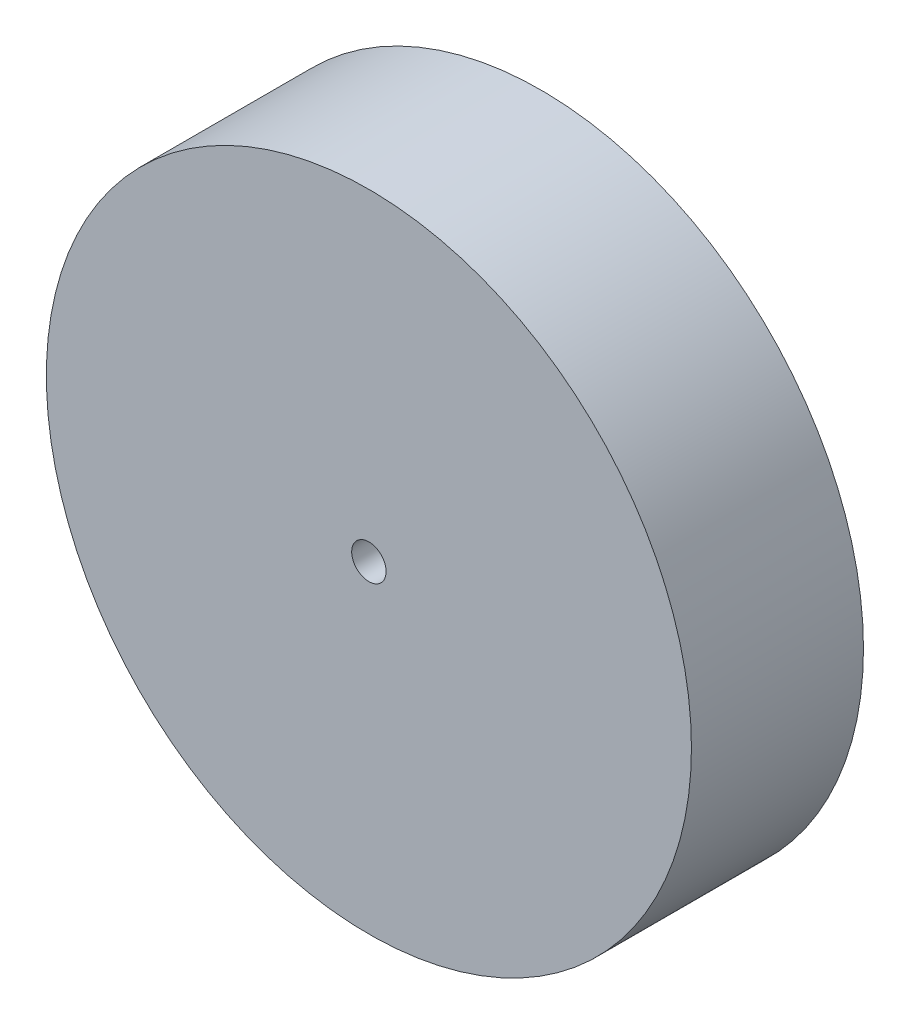
ISO-10303-21;
HEADER;
FILE_DESCRIPTION(('STEP AP214'),'2;1');
FILE_NAME('part.step','',(''),(''),'','','');
FILE_SCHEMA(('AUTOMOTIVE_DESIGN { 1 0 10303 214 1 1 1 1 }'));
ENDSEC;
DATA;
#1=APPLICATION_CONTEXT('core data for automotive mechanical design processes');
#2=APPLICATION_PROTOCOL_DEFINITION('international standard','automotive_design',2000,#1);
#3=PRODUCT_CONTEXT('',#1,'mechanical');
#4=PRODUCT('Part','Part','',(#3));
#5=PRODUCT_RELATED_PRODUCT_CATEGORY('part','',(#4));
#6=PRODUCT_DEFINITION_FORMATION('','',#4);
#7=PRODUCT_DEFINITION_CONTEXT('part definition',#1,'design');
#8=PRODUCT_DEFINITION('design','',#6,#7);
#9=PRODUCT_DEFINITION_SHAPE('','',#8);
#10=(LENGTH_UNIT() NAMED_UNIT(*) SI_UNIT(.MILLI.,.METRE.));
#11=(NAMED_UNIT(*) PLANE_ANGLE_UNIT() SI_UNIT($,.RADIAN.));
#12=(NAMED_UNIT(*) SI_UNIT($,.STERADIAN.) SOLID_ANGLE_UNIT());
#13=UNCERTAINTY_MEASURE_WITH_UNIT(LENGTH_MEASURE(1.E-05),#10,'distance_accuracy_value','');
#14=(GEOMETRIC_REPRESENTATION_CONTEXT(3) GLOBAL_UNCERTAINTY_ASSIGNED_CONTEXT((#13)) GLOBAL_UNIT_ASSIGNED_CONTEXT((#10,
#11,#12)) REPRESENTATION_CONTEXT('',''));
#15=CARTESIAN_POINT('',(0.,0.,0.));
#16=DIRECTION('',(0.,0.,1.));
#17=DIRECTION('',(1.,0.,0.));
#18=AXIS2_PLACEMENT_3D('',#15,#16,#17);
#19=CARTESIAN_POINT('',(0.,0.,20.));
#20=DIRECTION('',(0.,0.,1.));
#21=DIRECTION('',(1.,0.,0.));
#22=AXIS2_PLACEMENT_3D('',#19,#20,#21);
#23=PLANE('',#22);
#24=CARTESIAN_POINT('',(0.,0.,20.));
#25=DIRECTION('',(0.,0.,1.));
#26=DIRECTION('',(1.,0.,0.));
#27=AXIS2_PLACEMENT_3D('',#24,#25,#26);
#28=CIRCLE('',#27,37.5);
#29=CARTESIAN_POINT('',(37.5,0.,20.));
#30=VERTEX_POINT('',#29);
#31=EDGE_CURVE('E10',#30,#30,#28,.T.);
#32=ORIENTED_EDGE('',*,*,#31,.T.);
#33=EDGE_LOOP('',(#32));
#34=FACE_BOUND('',#33,.T.);
#35=CARTESIAN_POINT('',(0.,0.,20.));
#36=DIRECTION('',(0.,0.,1.));
#37=DIRECTION('',(1.,0.,0.));
#38=AXIS2_PLACEMENT_3D('',#35,#36,#37);
#39=CIRCLE('',#38,2.);
#40=CARTESIAN_POINT('',(2.,0.,20.));
#41=VERTEX_POINT('',#40);
#42=EDGE_CURVE('E42',#41,#41,#39,.T.);
#43=ORIENTED_EDGE('',*,*,#42,.F.);
#44=EDGE_LOOP('',(#43));
#45=FACE_BOUND('',#44,.T.);
#46=ADVANCED_FACE('F31',(#34,#45),#23,.T.);
#47=CARTESIAN_POINT('',(0.,0.,0.));
#48=DIRECTION('',(0.,0.,1.));
#49=DIRECTION('',(1.,0.,0.));
#50=AXIS2_PLACEMENT_3D('',#47,#48,#49);
#51=PLANE('',#50);
#52=CARTESIAN_POINT('',(0.,0.,0.));
#53=DIRECTION('',(0.,0.,1.));
#54=DIRECTION('',(1.,0.,0.));
#55=AXIS2_PLACEMENT_3D('',#52,#53,#54);
#56=CIRCLE('',#55,37.5);
#57=CARTESIAN_POINT('',(37.5,0.,0.));
#58=VERTEX_POINT('',#57);
#59=EDGE_CURVE('E35',#58,#58,#56,.T.);
#60=ORIENTED_EDGE('',*,*,#59,.F.);
#61=EDGE_LOOP('',(#60));
#62=FACE_BOUND('',#61,.T.);
#63=CARTESIAN_POINT('',(0.,0.,0.));
#64=DIRECTION('',(0.,0.,1.));
#65=DIRECTION('',(1.,0.,0.));
#66=AXIS2_PLACEMENT_3D('',#63,#64,#65);
#67=CIRCLE('',#66,2.);
#68=CARTESIAN_POINT('',(2.,0.,0.));
#69=VERTEX_POINT('',#68);
#70=EDGE_CURVE('E44',#69,#69,#67,.T.);
#71=ORIENTED_EDGE('',*,*,#70,.T.);
#72=EDGE_LOOP('',(#71));
#73=FACE_BOUND('',#72,.T.);
#74=ADVANCED_FACE('F54',(#62,#73),#51,.F.);
#75=CARTESIAN_POINT('',(0.,0.,20.));
#76=DIRECTION('',(0.,0.,-1.));
#77=DIRECTION('',(-1.,0.,0.));
#78=AXIS2_PLACEMENT_3D('',#75,#76,#77);
#79=CYLINDRICAL_SURFACE('',#78,37.5);
#80=ORIENTED_EDGE('',*,*,#31,.F.);
#81=EDGE_LOOP('',(#80));
#82=FACE_BOUND('',#81,.T.);
#83=ORIENTED_EDGE('',*,*,#59,.T.);
#84=EDGE_LOOP('',(#83));
#85=FACE_BOUND('',#84,.T.);
#86=ADVANCED_FACE('F33',(#82,#85),#79,.T.);
#87=CARTESIAN_POINT('',(0.,0.,20.));
#88=DIRECTION('',(0.,0.,-1.));
#89=DIRECTION('',(-1.,0.,0.));
#90=AXIS2_PLACEMENT_3D('',#87,#88,#89);
#91=CYLINDRICAL_SURFACE('',#90,2.);
#92=ORIENTED_EDGE('',*,*,#42,.T.);
#93=EDGE_LOOP('',(#92));
#94=FACE_BOUND('',#93,.T.);
#95=ORIENTED_EDGE('',*,*,#70,.F.);
#96=EDGE_LOOP('',(#95));
#97=FACE_BOUND('',#96,.T.);
#98=ADVANCED_FACE('F50',(#94,#97),#91,.F.);
#99=CLOSED_SHELL('',(#46,#74,#86,#98));
#100=MANIFOLD_SOLID_BREP('B2',#99);
#101=ADVANCED_BREP_SHAPE_REPRESENTATION('',(#18,#100),#14);
#102=SHAPE_DEFINITION_REPRESENTATION(#9,#101);
ENDSEC;
END-ISO-10303-21;
